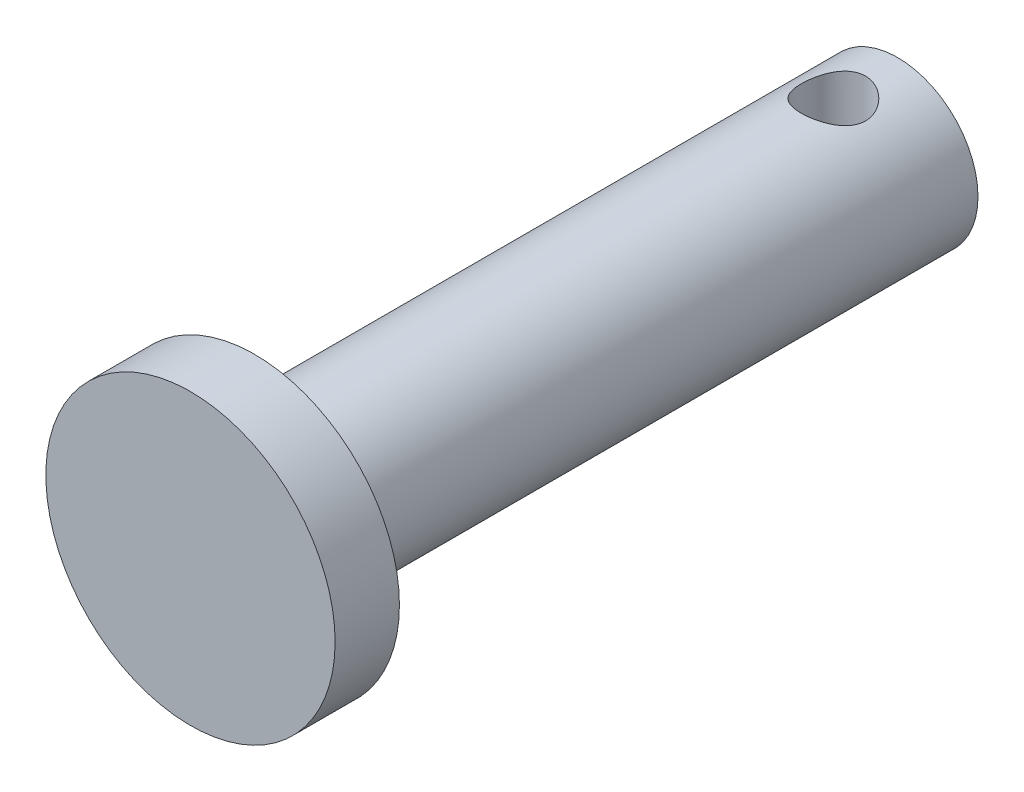
ISO-10303-21;
HEADER;
FILE_DESCRIPTION(('STEP AP214'),'2;1');
FILE_NAME('part.step','',(''),(''),'','','');
FILE_SCHEMA(('AUTOMOTIVE_DESIGN { 1 0 10303 214 1 1 1 1 }'));
ENDSEC;
DATA;
#1=APPLICATION_CONTEXT('core data for automotive mechanical design processes');
#2=APPLICATION_PROTOCOL_DEFINITION('international standard','automotive_design',2000,#1);
#3=PRODUCT_CONTEXT('',#1,'mechanical');
#4=PRODUCT('Part','Part','',(#3));
#5=PRODUCT_RELATED_PRODUCT_CATEGORY('part','',(#4));
#6=PRODUCT_DEFINITION_FORMATION('','',#4);
#7=PRODUCT_DEFINITION_CONTEXT('part definition',#1,'design');
#8=PRODUCT_DEFINITION('design','',#6,#7);
#9=PRODUCT_DEFINITION_SHAPE('','',#8);
#10=(LENGTH_UNIT() NAMED_UNIT(*) SI_UNIT(.MILLI.,.METRE.));
#11=(NAMED_UNIT(*) PLANE_ANGLE_UNIT() SI_UNIT($,.RADIAN.));
#12=(NAMED_UNIT(*) SI_UNIT($,.STERADIAN.) SOLID_ANGLE_UNIT());
#13=UNCERTAINTY_MEASURE_WITH_UNIT(LENGTH_MEASURE(1.E-05),#10,'distance_accuracy_value','');
#14=(GEOMETRIC_REPRESENTATION_CONTEXT(3) GLOBAL_UNCERTAINTY_ASSIGNED_CONTEXT((#13)) GLOBAL_UNIT_ASSIGNED_CONTEXT((#10,
#11,#12)) REPRESENTATION_CONTEXT('',''));
#15=CARTESIAN_POINT('',(0.,0.,0.));
#16=DIRECTION('',(0.,0.,1.));
#17=DIRECTION('',(1.,0.,0.));
#18=AXIS2_PLACEMENT_3D('',#15,#16,#17);
#19=CARTESIAN_POINT('',(0.,0.,20.));
#20=DIRECTION('',(0.,0.,-1.));
#21=DIRECTION('',(-1.,0.,0.));
#22=AXIS2_PLACEMENT_3D('',#19,#20,#21);
#23=CYLINDRICAL_SURFACE('',#22,2.5);
#24=CARTESIAN_POINT('',(0.,-2.5,3.));
#25=CARTESIAN_POINT('',(0.0537465027214456,-2.49999635613542,2.99999507408814));
#26=CARTESIAN_POINT('',(0.107586282045337,-2.49824647153466,2.99564112395581));
#27=CARTESIAN_POINT('',(0.213748240208948,-2.49141726550321,2.97837614823938));
#28=CARTESIAN_POINT('',(0.266065888780624,-2.48632889349439,2.96544186045693));
#29=CARTESIAN_POINT('',(0.367476961363701,-2.47337104606559,2.93156196097058));
#30=CARTESIAN_POINT('',(0.416580330808479,-2.46551068182036,2.91064257689163));
#31=CARTESIAN_POINT('',(0.510535985164184,-2.44778305398039,2.86149041333673));
#32=CARTESIAN_POINT('',(0.555389738375496,-2.43791648729028,2.83326017254053));
#33=CARTESIAN_POINT('',(0.641750503785196,-2.41665443085209,2.76888225071953));
#34=CARTESIAN_POINT('',(0.683031136275106,-2.40521148464595,2.73244667187987));
#35=CARTESIAN_POINT('',(0.759087502392361,-2.38230288453097,2.65329999826161));
#36=CARTESIAN_POINT('',(0.793860053566766,-2.37083722226896,2.61058585139413));
#37=CARTESIAN_POINT('',(0.857437283646439,-2.34861395898568,2.51778596487887));
#38=CARTESIAN_POINT('',(0.885907490597737,-2.33791057982476,2.4674567569884));
#39=CARTESIAN_POINT('',(0.933877359518574,-2.31916823593396,2.36223180078998));
#40=CARTESIAN_POINT('',(0.953381282142917,-2.31112800622088,2.30733823607582));
#41=CARTESIAN_POINT('',(0.981949411697933,-2.29913178830409,2.19714383320395));
#42=CARTESIAN_POINT('',(0.991446982902824,-2.29500710177802,2.14197438221189));
#43=CARTESIAN_POINT('',(1.00108648082001,-2.29082002024572,2.03068250084636));
#44=CARTESIAN_POINT('',(1.00123300815661,-2.29075562761384,1.97456055268749));
#45=CARTESIAN_POINT('',(0.992494683752272,-2.29455250139997,1.86712166427098));
#46=CARTESIAN_POINT('',(0.984237657152568,-2.29814087519225,1.81574214279548));
#47=CARTESIAN_POINT('',(0.95997344014891,-2.30838093803918,1.71517022199664));
#48=CARTESIAN_POINT('',(0.943964897402316,-2.31503316160836,1.66597820594484));
#49=CARTESIAN_POINT('',(0.904347366275536,-2.33079742544265,1.56999108190198));
#50=CARTESIAN_POINT('',(0.880589931157658,-2.33995689640394,1.52326538047265));
#51=CARTESIAN_POINT('',(0.826253230366107,-2.35969058194945,1.43429209181922));
#52=CARTESIAN_POINT('',(0.795671402550422,-2.37026532728424,1.39204619529859));
#53=CARTESIAN_POINT('',(0.725775299727217,-2.39263368371135,1.309795135599));
#54=CARTESIAN_POINT('',(0.685968731485317,-2.40445832488076,1.27021563527699));
#55=CARTESIAN_POINT('',(0.600157213715096,-2.42729912479141,1.19815776099898));
#56=CARTESIAN_POINT('',(0.554151032667216,-2.43831512222662,1.16568080129485));
#57=CARTESIAN_POINT('',(0.456038826302921,-2.45857340632274,1.10819127629208));
#58=CARTESIAN_POINT('',(0.403830245673238,-2.46777635047707,1.08333885940147));
#59=CARTESIAN_POINT('',(0.295511882741441,-2.48307414164379,1.04291606946097));
#60=CARTESIAN_POINT('',(0.239404098424837,-2.48917056731191,1.02734098122129));
#61=CARTESIAN_POINT('',(0.12844794380391,-2.49728069753455,1.00677585229015));
#62=CARTESIAN_POINT('',(0.0737216469927673,-2.49951472916757,1.00121377287322));
#63=CARTESIAN_POINT('',(-0.0359226549039086,-2.50034239255315,0.999143449735691));
#64=CARTESIAN_POINT('',(-0.0908406066119618,-2.49893696791146,1.00263285922624));
#65=CARTESIAN_POINT('',(-0.196716369560994,-2.49278783531876,1.01814587627599));
#66=CARTESIAN_POINT('',(-0.247741245887737,-2.48819695672762,1.02977899017549));
#67=CARTESIAN_POINT('',(-0.34706771403039,-2.4762972070275,1.06071785415491));
#68=CARTESIAN_POINT('',(-0.395368955112422,-2.46898798678265,1.08002458983434));
#69=CARTESIAN_POINT('',(-0.489539392908351,-2.45208297385406,1.12639246983997));
#70=CARTESIAN_POINT('',(-0.535289011377703,-2.44242407989902,1.15367273602157));
#71=CARTESIAN_POINT('',(-0.621721795623277,-2.42186682372762,1.21497016195282));
#72=CARTESIAN_POINT('',(-0.662402920380563,-2.41096796555135,1.24899002146131));
#73=CARTESIAN_POINT('',(-0.740361521514409,-2.38822558819056,1.32543500647481));
#74=CARTESIAN_POINT('',(-0.777236966903032,-2.37636720712526,1.3682667707531));
#75=CARTESIAN_POINT('',(-0.843375598706856,-2.35370836458566,1.45972004150468));
#76=CARTESIAN_POINT('',(-0.872637530668755,-2.34290807763255,1.50834250016997));
#77=CARTESIAN_POINT('',(-0.922903750965814,-2.32357149953854,1.61073084729705));
#78=CARTESIAN_POINT('',(-0.943825297267227,-2.31505815442394,1.66454199960615));
#79=CARTESIAN_POINT('',(-0.976148109852652,-2.30161836738966,1.77536682585758));
#80=CARTESIAN_POINT('',(-0.987556402634657,-2.29668927847999,1.83237810290621));
#81=CARTESIAN_POINT('',(-0.999857808639201,-2.29135879649963,1.94356395088727));
#82=CARTESIAN_POINT('',(-1.00144854115143,-2.29065710504086,1.99764741979667));
#83=CARTESIAN_POINT('',(-0.995901579638762,-2.29307418016549,2.10527242885664));
#84=CARTESIAN_POINT('',(-0.988764993956891,-2.29619246162397,2.15881403695129));
#85=CARTESIAN_POINT('',(-0.966535683076824,-2.3056332453951,2.26166609492752));
#86=CARTESIAN_POINT('',(-0.951768746785489,-2.31182415913725,2.3110601372165));
#87=CARTESIAN_POINT('',(-0.915002724245507,-2.32662000616348,2.40668931480674));
#88=CARTESIAN_POINT('',(-0.893001640696907,-2.33522560603003,2.45292357344991));
#89=CARTESIAN_POINT('',(-0.840936381379866,-2.35449304802246,2.54380480963539));
#90=CARTESIAN_POINT('',(-0.810482667579745,-2.36524441156621,2.58820933506524));
#91=CARTESIAN_POINT('',(-0.742946059635748,-2.38731902186119,2.67149665860188));
#92=CARTESIAN_POINT('',(-0.705861167409061,-2.39864244024203,2.71037778606415));
#93=CARTESIAN_POINT('',(-0.623252753136232,-2.42146783543697,2.78410142663181));
#94=CARTESIAN_POINT('',(-0.577338000573069,-2.43293378981093,2.81851865344903));
#95=CARTESIAN_POINT('',(-0.47995016014289,-2.45400203356858,2.87916852131082));
#96=CARTESIAN_POINT('',(-0.428474502273619,-2.46360345546453,2.90539735607626));
#97=CARTESIAN_POINT('',(-0.322369031247601,-2.47969857407931,2.94831110759514));
#98=CARTESIAN_POINT('',(-0.267815809109848,-2.48624681527514,2.96516466178017));
#99=CARTESIAN_POINT('',(-0.15643827314061,-2.49572153104683,2.98931956047713));
#100=CARTESIAN_POINT('',(-0.0996217629294562,-2.49865949747819,2.99665121837195));
#101=CARTESIAN_POINT('',(-0.0284561489454648,-2.49987949752068,2.99969769048914));
#102=CARTESIAN_POINT('',(-0.0142313443703792,-2.50000096484588,3.0000013043146));
#103=CARTESIAN_POINT('',(0.,-2.5,3.));
#104=B_SPLINE_CURVE_WITH_KNOTS('',3,(#24,#25,#26,#27,#28,#29,#30,#31,#32,#33,#34,#35,#36,#37,
#38,#39,#40,#41,#42,#43,#44,#45,#46,#47,#48,#49,#50,#51,#52,#53,#54,#55,#56,#57,#58,#59,#60,#61,
#62,#63,#64,#65,#66,#67,#68,#69,#70,#71,#72,#73,#74,#75,#76,#77,#78,#79,#80,#81,#82,#83,#84,#85,
#86,#87,#88,#89,#90,#91,#92,#93,#94,#95,#96,#97,#98,#99,#100,#101,#102,#103),.UNSPECIFIED.,.T.,
.F.,(4,2,2,2,2,2,2,2,2,2,2,2,2,2,2,2,2,2,2,2,2,2,2,2,2,2,2,2,2,2,2,2,2,2,2,2,2,2,2,4),(0.,
0.161201493946535,0.322841818003967,0.48395572873579,0.645013767839921,0.812986908501985,
0.981041974672057,1.15657629409608,1.33202711559134,1.49952052654414,1.66693153170244,
1.82269164200686,1.97847893628024,2.13744563149408,2.29647210969092,2.46779174593278,
2.63914546419866,2.81388456581403,2.98853478056895,3.15284592264004,3.31711446785041,
3.47400227782183,3.63091024496898,3.79261756699131,3.95438979749484,4.12684237312207,
4.29932334521874,4.47347522570414,4.64749836322967,4.80899836696374,4.97047786281523,
5.12557159274384,5.28070817902581,5.44472734028346,5.60879600674197,5.78350211766918,
5.95828931820266,6.12982150506659,6.30080626202171,6.34349022948398),.UNSPECIFIED.);
#105=CARTESIAN_POINT('',(0.,-2.5,3.));
#106=VERTEX_POINT('',#105);
#107=EDGE_CURVE('E41',#106,#106,#104,.T.);
#108=ORIENTED_EDGE('',*,*,#107,.T.);
#109=EDGE_LOOP('',(#108));
#110=FACE_BOUND('',#109,.T.);
#111=CARTESIAN_POINT('',(0.,2.5,3.));
#112=CARTESIAN_POINT('',(-0.0537465027214456,2.49999635613542,2.99999507408814));
#113=CARTESIAN_POINT('',(-0.107586282045337,2.49824647153466,2.99564112395581));
#114=CARTESIAN_POINT('',(-0.213748240208948,2.49141726550321,2.97837614823938));
#115=CARTESIAN_POINT('',(-0.266065888780624,2.48632889349439,2.96544186045693));
#116=CARTESIAN_POINT('',(-0.367476961363701,2.47337104606559,2.93156196097058));
#117=CARTESIAN_POINT('',(-0.416580330808479,2.46551068182036,2.91064257689163));
#118=CARTESIAN_POINT('',(-0.510535985164184,2.44778305398039,2.86149041333673));
#119=CARTESIAN_POINT('',(-0.555389738375496,2.43791648729028,2.83326017254053));
#120=CARTESIAN_POINT('',(-0.641750503785196,2.41665443085209,2.76888225071953));
#121=CARTESIAN_POINT('',(-0.683031136275106,2.40521148464595,2.73244667187987));
#122=CARTESIAN_POINT('',(-0.759087502392361,2.38230288453097,2.65329999826161));
#123=CARTESIAN_POINT('',(-0.793860053566766,2.37083722226896,2.61058585139413));
#124=CARTESIAN_POINT('',(-0.857437283646439,2.34861395898568,2.51778596487887));
#125=CARTESIAN_POINT('',(-0.885907490597737,2.33791057982476,2.4674567569884));
#126=CARTESIAN_POINT('',(-0.933877359518574,2.31916823593396,2.36223180078998));
#127=CARTESIAN_POINT('',(-0.953381282142917,2.31112800622088,2.30733823607582));
#128=CARTESIAN_POINT('',(-0.981949411697933,2.29913178830409,2.19714383320395));
#129=CARTESIAN_POINT('',(-0.991446982902824,2.29500710177802,2.14197438221189));
#130=CARTESIAN_POINT('',(-1.00108648082001,2.29082002024572,2.03068250084636));
#131=CARTESIAN_POINT('',(-1.00123300815661,2.29075562761384,1.97456055268749));
#132=CARTESIAN_POINT('',(-0.992494683752272,2.29455250139997,1.86712166427098));
#133=CARTESIAN_POINT('',(-0.984237657152568,2.29814087519225,1.81574214279548));
#134=CARTESIAN_POINT('',(-0.95997344014891,2.30838093803918,1.71517022199664));
#135=CARTESIAN_POINT('',(-0.943964897402316,2.31503316160836,1.66597820594484));
#136=CARTESIAN_POINT('',(-0.904347366275536,2.33079742544265,1.56999108190198));
#137=CARTESIAN_POINT('',(-0.880589931157658,2.33995689640394,1.52326538047265));
#138=CARTESIAN_POINT('',(-0.826253230366107,2.35969058194945,1.43429209181922));
#139=CARTESIAN_POINT('',(-0.795671402550422,2.37026532728424,1.39204619529859));
#140=CARTESIAN_POINT('',(-0.725775299727217,2.39263368371135,1.309795135599));
#141=CARTESIAN_POINT('',(-0.685968731485317,2.40445832488076,1.27021563527699));
#142=CARTESIAN_POINT('',(-0.600157213715096,2.42729912479141,1.19815776099898));
#143=CARTESIAN_POINT('',(-0.554151032667216,2.43831512222662,1.16568080129485));
#144=CARTESIAN_POINT('',(-0.456038826302921,2.45857340632274,1.10819127629208));
#145=CARTESIAN_POINT('',(-0.403830245673238,2.46777635047707,1.08333885940147));
#146=CARTESIAN_POINT('',(-0.295511882741441,2.48307414164379,1.04291606946097));
#147=CARTESIAN_POINT('',(-0.239404098424837,2.48917056731191,1.02734098122129));
#148=CARTESIAN_POINT('',(-0.12844794380391,2.49728069753455,1.00677585229015));
#149=CARTESIAN_POINT('',(-0.0737216469927673,2.49951472916757,1.00121377287322));
#150=CARTESIAN_POINT('',(0.0359226549039086,2.50034239255315,0.999143449735691));
#151=CARTESIAN_POINT('',(0.0908406066119618,2.49893696791146,1.00263285922624));
#152=CARTESIAN_POINT('',(0.196716369560994,2.49278783531876,1.01814587627599));
#153=CARTESIAN_POINT('',(0.247741245887737,2.48819695672762,1.02977899017549));
#154=CARTESIAN_POINT('',(0.34706771403039,2.4762972070275,1.06071785415491));
#155=CARTESIAN_POINT('',(0.395368955112422,2.46898798678265,1.08002458983434));
#156=CARTESIAN_POINT('',(0.489539392908351,2.45208297385406,1.12639246983997));
#157=CARTESIAN_POINT('',(0.535289011377703,2.44242407989902,1.15367273602157));
#158=CARTESIAN_POINT('',(0.621721795623277,2.42186682372762,1.21497016195282));
#159=CARTESIAN_POINT('',(0.662402920380563,2.41096796555135,1.24899002146131));
#160=CARTESIAN_POINT('',(0.740361521514409,2.38822558819056,1.32543500647481));
#161=CARTESIAN_POINT('',(0.777236966903032,2.37636720712526,1.3682667707531));
#162=CARTESIAN_POINT('',(0.843375598706856,2.35370836458566,1.45972004150468));
#163=CARTESIAN_POINT('',(0.872637530668755,2.34290807763255,1.50834250016997));
#164=CARTESIAN_POINT('',(0.922903750965814,2.32357149953854,1.61073084729705));
#165=CARTESIAN_POINT('',(0.943825297267227,2.31505815442394,1.66454199960615));
#166=CARTESIAN_POINT('',(0.976148109852652,2.30161836738966,1.77536682585758));
#167=CARTESIAN_POINT('',(0.987556402634657,2.29668927847999,1.83237810290621));
#168=CARTESIAN_POINT('',(0.999857808639201,2.29135879649963,1.94356395088727));
#169=CARTESIAN_POINT('',(1.00144854115143,2.29065710504086,1.99764741979667));
#170=CARTESIAN_POINT('',(0.995901579638762,2.29307418016549,2.10527242885664));
#171=CARTESIAN_POINT('',(0.988764993956891,2.29619246162397,2.15881403695129));
#172=CARTESIAN_POINT('',(0.966535683076824,2.3056332453951,2.26166609492752));
#173=CARTESIAN_POINT('',(0.951768746785489,2.31182415913725,2.3110601372165));
#174=CARTESIAN_POINT('',(0.915002724245507,2.32662000616348,2.40668931480674));
#175=CARTESIAN_POINT('',(0.893001640696907,2.33522560603003,2.45292357344991));
#176=CARTESIAN_POINT('',(0.840936381379866,2.35449304802246,2.54380480963539));
#177=CARTESIAN_POINT('',(0.810482667579745,2.36524441156621,2.58820933506524));
#178=CARTESIAN_POINT('',(0.742946059635748,2.38731902186119,2.67149665860188));
#179=CARTESIAN_POINT('',(0.705861167409061,2.39864244024203,2.71037778606415));
#180=CARTESIAN_POINT('',(0.623252753136232,2.42146783543697,2.78410142663181));
#181=CARTESIAN_POINT('',(0.577338000573069,2.43293378981093,2.81851865344903));
#182=CARTESIAN_POINT('',(0.47995016014289,2.45400203356858,2.87916852131082));
#183=CARTESIAN_POINT('',(0.428474502273619,2.46360345546453,2.90539735607626));
#184=CARTESIAN_POINT('',(0.322369031247601,2.47969857407931,2.94831110759514));
#185=CARTESIAN_POINT('',(0.267815809109848,2.48624681527514,2.96516466178017));
#186=CARTESIAN_POINT('',(0.15643827314061,2.49572153104683,2.98931956047713));
#187=CARTESIAN_POINT('',(0.0996217629294562,2.49865949747819,2.99665121837195));
#188=CARTESIAN_POINT('',(0.0284561489454648,2.49987949752068,2.99969769048914));
#189=CARTESIAN_POINT('',(0.0142313443703792,2.50000096484588,3.0000013043146));
#190=CARTESIAN_POINT('',(0.,2.5,3.));
#191=B_SPLINE_CURVE_WITH_KNOTS('',3,(#111,#112,#113,#114,#115,#116,#117,#118,#119,#120,#121,
#122,#123,#124,#125,#126,#127,#128,#129,#130,#131,#132,#133,#134,#135,#136,#137,#138,#139,#140,
#141,#142,#143,#144,#145,#146,#147,#148,#149,#150,#151,#152,#153,#154,#155,#156,#157,#158,#159,
#160,#161,#162,#163,#164,#165,#166,#167,#168,#169,#170,#171,#172,#173,#174,#175,#176,#177,#178,
#179,#180,#181,#182,#183,#184,#185,#186,#187,#188,#189,#190),.UNSPECIFIED.,.T.,.F.,(4,2,2,2,2,2,
2,2,2,2,2,2,2,2,2,2,2,2,2,2,2,2,2,2,2,2,2,2,2,2,2,2,2,2,2,2,2,2,2,4),(0.,0.161201493946535,
0.322841818003967,0.48395572873579,0.645013767839921,0.812986908501985,0.981041974672057,
1.15657629409608,1.33202711559134,1.49952052654414,1.66693153170244,1.82269164200686,
1.97847893628024,2.13744563149408,2.29647210969092,2.46779174593278,2.63914546419866,
2.81388456581403,2.98853478056895,3.15284592264004,3.31711446785041,3.47400227782183,
3.63091024496898,3.79261756699131,3.95438979749484,4.12684237312207,4.29932334521874,
4.47347522570414,4.64749836322967,4.80899836696374,4.97047786281523,5.12557159274384,
5.28070817902581,5.44472734028346,5.60879600674197,5.78350211766918,5.95828931820266,
6.12982150506659,6.30080626202171,6.34349022948398),.UNSPECIFIED.);
#192=CARTESIAN_POINT('',(0.,2.5,3.));
#193=VERTEX_POINT('',#192);
#194=EDGE_CURVE('E59',#193,#193,#191,.T.);
#195=ORIENTED_EDGE('',*,*,#194,.T.);
#196=EDGE_LOOP('',(#195));
#197=FACE_BOUND('',#196,.T.);
#198=CARTESIAN_POINT('',(0.,0.,20.));
#199=DIRECTION('',(0.,0.,1.));
#200=DIRECTION('',(1.,0.,0.));
#201=AXIS2_PLACEMENT_3D('',#198,#199,#200);
#202=CIRCLE('',#201,2.5);
#203=CARTESIAN_POINT('',(2.5,0.,20.));
#204=VERTEX_POINT('',#203);
#205=EDGE_CURVE('E10',#204,#204,#202,.T.);
#206=ORIENTED_EDGE('',*,*,#205,.F.);
#207=EDGE_LOOP('',(#206));
#208=FACE_BOUND('',#207,.T.);
#209=CARTESIAN_POINT('',(0.,0.,0.));
#210=DIRECTION('',(0.,0.,1.));
#211=DIRECTION('',(1.,0.,0.));
#212=AXIS2_PLACEMENT_3D('',#209,#210,#211);
#213=CIRCLE('',#212,2.5);
#214=CARTESIAN_POINT('',(2.5,0.,0.));
#215=VERTEX_POINT('',#214);
#216=EDGE_CURVE('E49',#215,#215,#213,.T.);
#217=ORIENTED_EDGE('',*,*,#216,.T.);
#218=EDGE_LOOP('',(#217));
#219=FACE_BOUND('',#218,.T.);
#220=ADVANCED_FACE('F37',(#110,#197,#208,#219),#23,.T.);
#221=CARTESIAN_POINT('',(0.,0.,0.));
#222=DIRECTION('',(0.,0.,1.));
#223=DIRECTION('',(1.,0.,0.));
#224=AXIS2_PLACEMENT_3D('',#221,#222,#223);
#225=PLANE('',#224);
#226=ORIENTED_EDGE('',*,*,#216,.F.);
#227=EDGE_LOOP('',(#226));
#228=FACE_BOUND('',#227,.T.);
#229=ADVANCED_FACE('F79',(#228),#225,.F.);
#230=CARTESIAN_POINT('',(0.,0.,22.));
#231=DIRECTION('',(0.,0.,-1.));
#232=DIRECTION('',(-1.,0.,0.));
#233=AXIS2_PLACEMENT_3D('',#230,#231,#232);
#234=CYLINDRICAL_SURFACE('',#233,4.5);
#235=CARTESIAN_POINT('',(0.,0.,22.));
#236=DIRECTION('',(0.,0.,1.));
#237=DIRECTION('',(1.,0.,0.));
#238=AXIS2_PLACEMENT_3D('',#235,#236,#237);
#239=CIRCLE('',#238,4.5);
#240=CARTESIAN_POINT('',(4.5,0.,22.));
#241=VERTEX_POINT('',#240);
#242=EDGE_CURVE('E54',#241,#241,#239,.T.);
#243=ORIENTED_EDGE('',*,*,#242,.F.);
#244=EDGE_LOOP('',(#243));
#245=FACE_BOUND('',#244,.T.);
#246=CARTESIAN_POINT('',(0.,0.,20.));
#247=DIRECTION('',(0.,0.,1.));
#248=DIRECTION('',(1.,0.,0.));
#249=AXIS2_PLACEMENT_3D('',#246,#247,#248);
#250=CIRCLE('',#249,4.5);
#251=CARTESIAN_POINT('',(4.5,0.,20.));
#252=VERTEX_POINT('',#251);
#253=EDGE_CURVE('E57',#252,#252,#250,.T.);
#254=ORIENTED_EDGE('',*,*,#253,.T.);
#255=EDGE_LOOP('',(#254));
#256=FACE_BOUND('',#255,.T.);
#257=ADVANCED_FACE('F74',(#245,#256),#234,.T.);
#258=CARTESIAN_POINT('',(0.,0.,22.));
#259=DIRECTION('',(0.,0.,1.));
#260=DIRECTION('',(1.,0.,0.));
#261=AXIS2_PLACEMENT_3D('',#258,#259,#260);
#262=PLANE('',#261);
#263=ORIENTED_EDGE('',*,*,#242,.T.);
#264=EDGE_LOOP('',(#263));
#265=FACE_BOUND('',#264,.T.);
#266=ADVANCED_FACE('F70',(#265),#262,.T.);
#267=CARTESIAN_POINT('',(0.,0.,20.));
#268=DIRECTION('',(0.,0.,1.));
#269=DIRECTION('',(1.,0.,0.));
#270=AXIS2_PLACEMENT_3D('',#267,#268,#269);
#271=PLANE('',#270);
#272=ORIENTED_EDGE('',*,*,#205,.T.);
#273=EDGE_LOOP('',(#272));
#274=FACE_BOUND('',#273,.T.);
#275=ORIENTED_EDGE('',*,*,#253,.F.);
#276=EDGE_LOOP('',(#275));
#277=FACE_BOUND('',#276,.T.);
#278=ADVANCED_FACE('F68',(#274,#277),#271,.F.);
#279=CARTESIAN_POINT('',(0.,-4.5,2.));
#280=DIRECTION('',(0.,1.,0.));
#281=DIRECTION('',(0.,0.,1.));
#282=AXIS2_PLACEMENT_3D('',#279,#280,#281);
#283=CYLINDRICAL_SURFACE('',#282,1.);
#284=ORIENTED_EDGE('',*,*,#194,.F.);
#285=EDGE_LOOP('',(#284));
#286=FACE_BOUND('',#285,.T.);
#287=ORIENTED_EDGE('',*,*,#107,.F.);
#288=EDGE_LOOP('',(#287));
#289=FACE_BOUND('',#288,.T.);
#290=ADVANCED_FACE('F64',(#286,#289),#283,.F.);
#291=CLOSED_SHELL('',(#220,#229,#257,#266,#278,#290));
#292=MANIFOLD_SOLID_BREP('B2',#291);
#293=ADVANCED_BREP_SHAPE_REPRESENTATION('',(#18,#292),#14);
#294=SHAPE_DEFINITION_REPRESENTATION(#9,#293);
ENDSEC;
END-ISO-10303-21;
